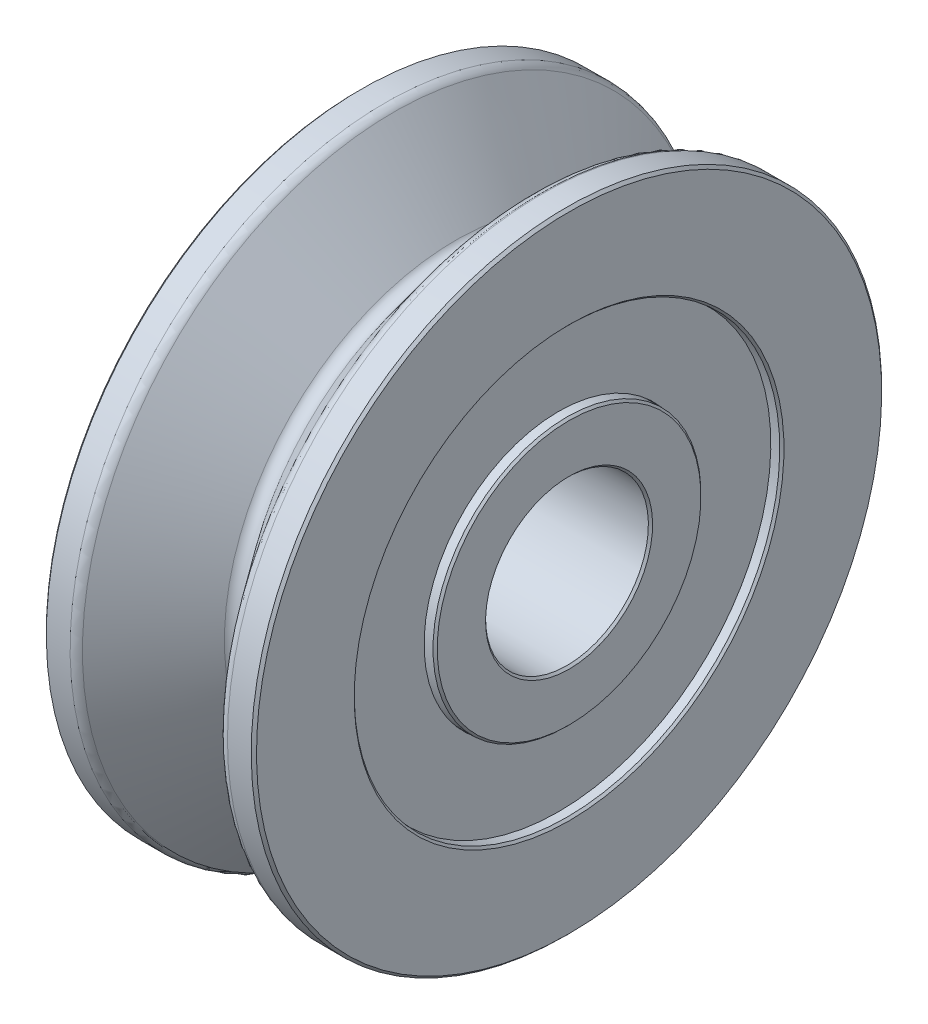
ISO-10303-21;
HEADER;
FILE_DESCRIPTION(('STEP AP214'),'2;1');
FILE_NAME('part.step','',(''),(''),'','','');
FILE_SCHEMA(('AUTOMOTIVE_DESIGN { 1 0 10303 214 1 1 1 1 }'));
ENDSEC;
DATA;
#1=APPLICATION_CONTEXT('core data for automotive mechanical design processes');
#2=APPLICATION_PROTOCOL_DEFINITION('international standard','automotive_design',2000,#1);
#3=PRODUCT_CONTEXT('',#1,'mechanical');
#4=PRODUCT('Part','Part','',(#3));
#5=PRODUCT_RELATED_PRODUCT_CATEGORY('part','',(#4));
#6=PRODUCT_DEFINITION_FORMATION('','',#4);
#7=PRODUCT_DEFINITION_CONTEXT('part definition',#1,'design');
#8=PRODUCT_DEFINITION('design','',#6,#7);
#9=PRODUCT_DEFINITION_SHAPE('','',#8);
#10=(LENGTH_UNIT() NAMED_UNIT(*) SI_UNIT(.MILLI.,.METRE.));
#11=(NAMED_UNIT(*) PLANE_ANGLE_UNIT() SI_UNIT($,.RADIAN.));
#12=(NAMED_UNIT(*) SI_UNIT($,.STERADIAN.) SOLID_ANGLE_UNIT());
#13=UNCERTAINTY_MEASURE_WITH_UNIT(LENGTH_MEASURE(1.E-05),#10,'distance_accuracy_value','');
#14=(GEOMETRIC_REPRESENTATION_CONTEXT(3) GLOBAL_UNCERTAINTY_ASSIGNED_CONTEXT((#13)) GLOBAL_UNIT_ASSIGNED_CONTEXT((#10,
#11,#12)) REPRESENTATION_CONTEXT('',''));
#15=CARTESIAN_POINT('',(0.,0.,0.));
#16=DIRECTION('',(0.,0.,1.));
#17=DIRECTION('',(1.,0.,0.));
#18=AXIS2_PLACEMENT_3D('',#15,#16,#17);
#19=CARTESIAN_POINT('',(1.8,0.,0.));
#20=DIRECTION('',(1.,0.,0.));
#21=DIRECTION('',(0.,1.,0.));
#22=AXIS2_PLACEMENT_3D('',#19,#20,#21);
#23=PLANE('',#22);
#24=CARTESIAN_POINT('',(1.8,0.,0.));
#25=DIRECTION('',(-1.,0.,0.));
#26=DIRECTION('',(0.,1.,0.));
#27=AXIS2_PLACEMENT_3D('',#24,#25,#26);
#28=CIRCLE('',#27,2.56);
#29=CARTESIAN_POINT('',(1.8,-2.56,0.));
#30=VERTEX_POINT('',#29);
#31=EDGE_CURVE('P0_E61',#30,#30,#28,.T.);
#32=ORIENTED_EDGE('',*,*,#31,.T.);
#33=EDGE_LOOP('',(#32));
#34=FACE_BOUND('',#33,.T.);
#35=CARTESIAN_POINT('',(1.8,0.,0.));
#36=DIRECTION('',(1.,0.,0.));
#37=DIRECTION('',(0.,1.,0.));
#38=AXIS2_PLACEMENT_3D('',#35,#36,#37);
#39=CIRCLE('',#38,4.04);
#40=CARTESIAN_POINT('',(1.8,-4.04,0.));
#41=VERTEX_POINT('',#40);
#42=EDGE_CURVE('P0_E28',#41,#41,#39,.T.);
#43=ORIENTED_EDGE('',*,*,#42,.T.);
#44=EDGE_LOOP('',(#43));
#45=FACE_BOUND('',#44,.T.);
#46=ADVANCED_FACE('P0_F17',(#34,#45),#23,.T.);
#47=CARTESIAN_POINT('',(0.,0.,0.));
#48=DIRECTION('',(1.,0.,0.));
#49=DIRECTION('',(0.,1.,0.));
#50=AXIS2_PLACEMENT_3D('',#47,#48,#49);
#51=CYLINDRICAL_SURFACE('',#50,4.04);
#52=ORIENTED_EDGE('',*,*,#42,.F.);
#53=DIRECTION('',(-1.,0.,0.));
#54=VECTOR('',#53,1.);
#55=CARTESIAN_POINT('',(0.,-4.04,0.));
#56=LINE('',#55,#54);
#57=CARTESIAN_POINT('',(-1.8,-4.04,0.));
#58=VERTEX_POINT('',#57);
#59=EDGE_CURVE('P0_E11',#41,#58,#56,.T.);
#60=ORIENTED_EDGE('',*,*,#59,.T.);
#61=CARTESIAN_POINT('',(-1.8,0.,0.));
#62=DIRECTION('',(-1.,0.,0.));
#63=DIRECTION('',(0.,1.,0.));
#64=AXIS2_PLACEMENT_3D('',#61,#62,#63);
#65=CIRCLE('',#64,4.04);
#66=EDGE_CURVE('P0_E51',#58,#58,#65,.T.);
#67=ORIENTED_EDGE('',*,*,#66,.F.);
#68=ORIENTED_EDGE('',*,*,#59,.F.);
#69=EDGE_LOOP('',(#52,#60,#67,#68));
#70=FACE_BOUND('',#69,.T.);
#71=ADVANCED_FACE('P0_F50',(#70),#51,.T.);
#72=CARTESIAN_POINT('',(0.,0.,0.));
#73=DIRECTION('',(1.,0.,0.));
#74=DIRECTION('',(0.,1.,0.));
#75=AXIS2_PLACEMENT_3D('',#72,#73,#74);
#76=CYLINDRICAL_SURFACE('',#75,2.56);
#77=ORIENTED_EDGE('',*,*,#31,.F.);
#78=DIRECTION('',(-1.,0.,0.));
#79=VECTOR('',#78,1.);
#80=CARTESIAN_POINT('',(0.,-2.56,0.));
#81=LINE('',#80,#79);
#82=CARTESIAN_POINT('',(-1.8,-2.56,0.));
#83=VERTEX_POINT('',#82);
#84=EDGE_CURVE('P0_E21',#30,#83,#81,.T.);
#85=ORIENTED_EDGE('',*,*,#84,.T.);
#86=CARTESIAN_POINT('',(-1.8,0.,0.));
#87=DIRECTION('',(1.,0.,0.));
#88=DIRECTION('',(0.,1.,0.));
#89=AXIS2_PLACEMENT_3D('',#86,#87,#88);
#90=CIRCLE('',#89,2.56);
#91=EDGE_CURVE('P0_E54',#83,#83,#90,.T.);
#92=ORIENTED_EDGE('',*,*,#91,.F.);
#93=ORIENTED_EDGE('',*,*,#84,.F.);
#94=EDGE_LOOP('',(#77,#85,#92,#93));
#95=FACE_BOUND('',#94,.T.);
#96=ADVANCED_FACE('P0_F79',(#95),#76,.F.);
#97=CARTESIAN_POINT('',(-1.8,0.,0.));
#98=DIRECTION('',(1.,0.,0.));
#99=DIRECTION('',(0.,1.,0.));
#100=AXIS2_PLACEMENT_3D('',#97,#98,#99);
#101=PLANE('',#100);
#102=ORIENTED_EDGE('',*,*,#91,.T.);
#103=EDGE_LOOP('',(#102));
#104=FACE_BOUND('',#103,.T.);
#105=ORIENTED_EDGE('',*,*,#66,.T.);
#106=EDGE_LOOP('',(#105));
#107=FACE_BOUND('',#106,.T.);
#108=ADVANCED_FACE('P0_F19',(#104,#107),#101,.F.);
#109=CLOSED_SHELL('',(#46,#71,#96,#108));
#110=MANIFOLD_SOLID_BREP('P0_B1',#109);
#111=CARTESIAN_POINT('',(-2.,0.,0.));
#112=DIRECTION('',(1.,0.,0.));
#113=DIRECTION('',(0.,1.,0.));
#114=AXIS2_PLACEMENT_3D('',#111,#112,#113);
#115=PLANE('',#114);
#116=CARTESIAN_POINT('',(-2.,0.,0.));
#117=DIRECTION('',(1.,0.,0.));
#118=DIRECTION('',(0.,1.,0.));
#119=AXIS2_PLACEMENT_3D('',#116,#117,#118);
#120=CIRCLE('',#119,1.55);
#121=CARTESIAN_POINT('',(-2.,-1.55,0.));
#122=VERTEX_POINT('',#121);
#123=EDGE_CURVE('P1_E64',#122,#122,#120,.T.);
#124=ORIENTED_EDGE('',*,*,#123,.T.);
#125=EDGE_LOOP('',(#124));
#126=FACE_BOUND('',#125,.T.);
#127=CARTESIAN_POINT('',(-2.,0.,0.));
#128=DIRECTION('',(-1.,0.,0.));
#129=DIRECTION('',(0.,1.,0.));
#130=AXIS2_PLACEMENT_3D('',#127,#128,#129);
#131=CIRCLE('',#130,2.55);
#132=CARTESIAN_POINT('',(-2.,-2.55,0.));
#133=VERTEX_POINT('',#132);
#134=EDGE_CURVE('P1_E11',#133,#133,#131,.T.);
#135=ORIENTED_EDGE('',*,*,#134,.T.);
#136=EDGE_LOOP('',(#135));
#137=FACE_BOUND('',#136,.T.);
#138=ADVANCED_FACE('P1_F17',(#126,#137),#115,.F.);
#139=CARTESIAN_POINT('',(0.,0.,0.));
#140=DIRECTION('',(1.,0.,0.));
#141=DIRECTION('',(0.,1.,0.));
#142=AXIS2_PLACEMENT_3D('',#139,#140,#141);
#143=CYLINDRICAL_SURFACE('',#142,2.55);
#144=CARTESIAN_POINT('',(1.96,0.,0.));
#145=DIRECTION('',(1.,0.,0.));
#146=DIRECTION('',(0.,1.,0.));
#147=AXIS2_PLACEMENT_3D('',#144,#145,#146);
#148=CIRCLE('',#147,2.55);
#149=CARTESIAN_POINT('',(1.96,-2.55,0.));
#150=VERTEX_POINT('',#149);
#151=EDGE_CURVE('P1_E21',#150,#150,#148,.T.);
#152=ORIENTED_EDGE('',*,*,#151,.F.);
#153=DIRECTION('',(-1.,0.,0.));
#154=VECTOR('',#153,1.);
#155=CARTESIAN_POINT('',(0.,-2.55,0.));
#156=LINE('',#155,#154);
#157=EDGE_CURVE('P1_E28',#150,#133,#156,.T.);
#158=ORIENTED_EDGE('',*,*,#157,.T.);
#159=ORIENTED_EDGE('',*,*,#134,.F.);
#160=ORIENTED_EDGE('',*,*,#157,.F.);
#161=EDGE_LOOP('',(#152,#158,#159,#160));
#162=FACE_BOUND('',#161,.T.);
#163=ADVANCED_FACE('P1_F107',(#162),#143,.T.);
#164=CARTESIAN_POINT('',(1.98,0.,0.));
#165=DIRECTION('',(-1.,0.,0.));
#166=DIRECTION('',(0.,1.,0.));
#167=AXIS2_PLACEMENT_3D('',#164,#165,#166);
#168=CONICAL_SURFACE('',#167,2.53,0.785398163397448);
#169=CARTESIAN_POINT('',(2.,0.,0.));
#170=DIRECTION('',(-1.,0.,0.));
#171=DIRECTION('',(0.,1.,0.));
#172=AXIS2_PLACEMENT_3D('',#169,#170,#171);
#173=CIRCLE('',#172,2.51);
#174=CARTESIAN_POINT('',(2.,-2.51,0.));
#175=VERTEX_POINT('',#174);
#176=EDGE_CURVE('P1_E66',#175,#175,#173,.T.);
#177=ORIENTED_EDGE('',*,*,#176,.T.);
#178=DIRECTION('',(-0.707106781186548,-0.707106781186548,0.));
#179=VECTOR('',#178,1.);
#180=CARTESIAN_POINT('',(1.98,-2.53,0.));
#181=LINE('',#180,#179);
#182=EDGE_CURVE('P1_E84',#175,#150,#181,.T.);
#183=ORIENTED_EDGE('',*,*,#182,.T.);
#184=ORIENTED_EDGE('',*,*,#151,.T.);
#185=ORIENTED_EDGE('',*,*,#182,.F.);
#186=EDGE_LOOP('',(#177,#183,#184,#185));
#187=FACE_BOUND('',#186,.T.);
#188=ADVANCED_FACE('P1_F109',(#187),#168,.T.);
#189=CARTESIAN_POINT('',(0.,0.,0.));
#190=DIRECTION('',(1.,0.,0.));
#191=DIRECTION('',(0.,1.,0.));
#192=AXIS2_PLACEMENT_3D('',#189,#190,#191);
#193=CYLINDRICAL_SURFACE('',#192,1.55);
#194=CARTESIAN_POINT('',(1.96,0.,0.));
#195=DIRECTION('',(-1.,0.,0.));
#196=DIRECTION('',(0.,1.,0.));
#197=AXIS2_PLACEMENT_3D('',#194,#195,#196);
#198=CIRCLE('',#197,1.55);
#199=CARTESIAN_POINT('',(1.96,-1.55,0.));
#200=VERTEX_POINT('',#199);
#201=EDGE_CURVE('P1_E62',#200,#200,#198,.T.);
#202=ORIENTED_EDGE('',*,*,#201,.F.);
#203=DIRECTION('',(-1.,0.,0.));
#204=VECTOR('',#203,1.);
#205=CARTESIAN_POINT('',(0.,-1.55,0.));
#206=LINE('',#205,#204);
#207=EDGE_CURVE('P1_E59',#200,#122,#206,.T.);
#208=ORIENTED_EDGE('',*,*,#207,.T.);
#209=ORIENTED_EDGE('',*,*,#123,.F.);
#210=ORIENTED_EDGE('',*,*,#207,.F.);
#211=EDGE_LOOP('',(#202,#208,#209,#210));
#212=FACE_BOUND('',#211,.T.);
#213=ADVANCED_FACE('P1_F61',(#212),#193,.F.);
#214=CARTESIAN_POINT('',(2.,0.,0.));
#215=DIRECTION('',(1.,0.,0.));
#216=DIRECTION('',(0.,1.,0.));
#217=AXIS2_PLACEMENT_3D('',#214,#215,#216);
#218=PLANE('',#217);
#219=CARTESIAN_POINT('',(2.,0.,0.));
#220=DIRECTION('',(1.,0.,0.));
#221=DIRECTION('',(0.,1.,0.));
#222=AXIS2_PLACEMENT_3D('',#219,#220,#221);
#223=CIRCLE('',#222,1.59);
#224=CARTESIAN_POINT('',(2.,-1.59,0.));
#225=VERTEX_POINT('',#224);
#226=EDGE_CURVE('P1_E81',#225,#225,#223,.T.);
#227=ORIENTED_EDGE('',*,*,#226,.F.);
#228=EDGE_LOOP('',(#227));
#229=FACE_BOUND('',#228,.T.);
#230=ORIENTED_EDGE('',*,*,#176,.F.);
#231=EDGE_LOOP('',(#230));
#232=FACE_BOUND('',#231,.T.);
#233=ADVANCED_FACE('P1_F19',(#229,#232),#218,.T.);
#234=CARTESIAN_POINT('',(1.98,0.,0.));
#235=DIRECTION('',(1.,0.,0.));
#236=DIRECTION('',(0.,1.,0.));
#237=AXIS2_PLACEMENT_3D('',#234,#235,#236);
#238=CONICAL_SURFACE('',#237,1.57,0.785398163397448);
#239=ORIENTED_EDGE('',*,*,#226,.T.);
#240=DIRECTION('',(-0.707106781186548,0.707106781186548,0.));
#241=VECTOR('',#240,1.);
#242=CARTESIAN_POINT('',(1.98,-1.57,0.));
#243=LINE('',#242,#241);
#244=EDGE_CURVE('P1_E71',#225,#200,#243,.T.);
#245=ORIENTED_EDGE('',*,*,#244,.T.);
#246=ORIENTED_EDGE('',*,*,#201,.T.);
#247=ORIENTED_EDGE('',*,*,#244,.F.);
#248=EDGE_LOOP('',(#239,#245,#246,#247));
#249=FACE_BOUND('',#248,.T.);
#250=ADVANCED_FACE('P1_F70',(#249),#238,.F.);
#251=CLOSED_SHELL('',(#138,#163,#188,#213,#233,#250));
#252=MANIFOLD_SOLID_BREP('P1_B1',#251);
#253=CARTESIAN_POINT('',(0.,0.,0.));
#254=DIRECTION('',(-1.,0.,0.));
#255=DIRECTION('',(0.,0.,1.));
#256=AXIS2_PLACEMENT_3D('',#253,#254,#255);
#257=TOROIDAL_SURFACE('',#256,4.52576440717118,0.2);
#258=CARTESIAN_POINT('',(0.157870443475266,0.,0.));
#259=DIRECTION('',(-1.,0.,0.));
#260=DIRECTION('',(0.,0.,-1.));
#261=AXIS2_PLACEMENT_3D('',#258,#259,#260);
#262=CIRCLE('',#261,4.4029762844682);
#263=CARTESIAN_POINT('',(0.157870443475265,0.,-4.4029762844682));
#264=VERTEX_POINT('',#263);
#265=EDGE_CURVE('P2_E140',#264,#264,#262,.T.);
#266=ORIENTED_EDGE('',*,*,#265,.T.);
#267=CARTESIAN_POINT('',(0.,0.,-4.52576440717118));
#268=DIRECTION('',(0.,-1.,0.));
#269=DIRECTION('',(0.,0.,-1.));
#270=AXIS2_PLACEMENT_3D('',#267,#268,#269);
#271=CIRCLE('',#270,0.2);
#272=CARTESIAN_POINT('',(-0.157870443475265,0.,-4.4029762844682));
#273=VERTEX_POINT('',#272);
#274=EDGE_CURVE('P2_E11',#264,#273,#271,.T.);
#275=ORIENTED_EDGE('',*,*,#274,.T.);
#276=CARTESIAN_POINT('',(-0.157870443475266,0.,0.));
#277=DIRECTION('',(1.,0.,0.));
#278=DIRECTION('',(0.,0.,-1.));
#279=AXIS2_PLACEMENT_3D('',#276,#277,#278);
#280=CIRCLE('',#279,4.4029762844682);
#281=EDGE_CURVE('P2_E260',#273,#273,#280,.T.);
#282=ORIENTED_EDGE('',*,*,#281,.T.);
#283=ORIENTED_EDGE('',*,*,#274,.F.);
#284=EDGE_LOOP('',(#266,#275,#282,#283));
#285=FACE_BOUND('',#284,.T.);
#286=ADVANCED_FACE('P2_F17',(#285),#257,.F.);
#287=CARTESIAN_POINT('',(-0.7,0.,0.));
#288=DIRECTION('',(-1.,0.,0.));
#289=DIRECTION('',(0.,0.,1.));
#290=AXIS2_PLACEMENT_3D('',#287,#288,#289);
#291=CONICAL_SURFACE('',#290,5.1,0.90975315794421);
#292=ORIENTED_EDGE('',*,*,#281,.F.);
#293=DIRECTION('',(-0.61394061351492,0.,-0.789352217376327));
#294=VECTOR('',#293,1.);
#295=CARTESIAN_POINT('',(-0.7,0.,-5.1));
#296=LINE('',#295,#294);
#297=CARTESIAN_POINT('',(-1.33994631765788,0.,-5.92278812270298));
#298=VERTEX_POINT('',#297);
#299=EDGE_CURVE('P2_E21',#273,#298,#296,.T.);
#300=ORIENTED_EDGE('',*,*,#299,.T.);
#301=CARTESIAN_POINT('',(-1.33994631765788,0.,0.));
#302=DIRECTION('',(-1.,0.,0.));
#303=DIRECTION('',(0.,0.,-1.));
#304=AXIS2_PLACEMENT_3D('',#301,#302,#303);
#305=CIRCLE('',#304,5.92278812270298);
#306=EDGE_CURVE('P2_E137',#298,#298,#305,.T.);
#307=ORIENTED_EDGE('',*,*,#306,.F.);
#308=ORIENTED_EDGE('',*,*,#299,.F.);
#309=EDGE_LOOP('',(#292,#300,#307,#308));
#310=FACE_BOUND('',#309,.T.);
#311=ADVANCED_FACE('P2_F234',(#310),#291,.T.);
#312=CARTESIAN_POINT('',(-1.49781676113314,0.,0.));
#313=DIRECTION('',(-1.,0.,0.));
#314=DIRECTION('',(0.,0.,1.));
#315=AXIS2_PLACEMENT_3D('',#312,#313,#314);
#316=TOROIDAL_SURFACE('',#315,5.8,0.2);
#317=CARTESIAN_POINT('',(-1.49781676113314,0.,0.));
#318=DIRECTION('',(1.,0.,0.));
#319=DIRECTION('',(0.,0.,-1.));
#320=AXIS2_PLACEMENT_3D('',#317,#318,#319);
#321=CIRCLE('',#320,6.);
#322=CARTESIAN_POINT('',(-1.49781676113314,0.,-6.));
#323=VERTEX_POINT('',#322);
#324=CARTESIAN_POINT('',(-1.49781676113314,-6.,0.));
#325=VERTEX_POINT('',#324);
#326=EDGE_CURVE('P2_E112',#323,#325,#321,.T.);
#327=ORIENTED_EDGE('',*,*,#326,.T.);
#328=CARTESIAN_POINT('',(-1.49781676113314,0.,0.));
#329=DIRECTION('',(1.,0.,0.));
#330=DIRECTION('',(0.,0.,-1.));
#331=AXIS2_PLACEMENT_3D('',#328,#329,#330);
#332=CIRCLE('',#331,6.);
#333=EDGE_CURVE('P2_E118',#325,#323,#332,.T.);
#334=ORIENTED_EDGE('',*,*,#333,.T.);
#335=CARTESIAN_POINT('',(-1.49781676113314,0.,-5.8));
#336=DIRECTION('',(0.,-1.,0.));
#337=DIRECTION('',(0.,0.,-1.));
#338=AXIS2_PLACEMENT_3D('',#335,#336,#337);
#339=CIRCLE('',#338,0.2);
#340=EDGE_CURVE('P2_E126',#323,#298,#339,.T.);
#341=ORIENTED_EDGE('',*,*,#340,.T.);
#342=ORIENTED_EDGE('',*,*,#306,.T.);
#343=ORIENTED_EDGE('',*,*,#340,.F.);
#344=EDGE_LOOP('',(#327,#334,#341,#342,#343));
#345=FACE_BOUND('',#344,.T.);
#346=ADVANCED_FACE('P2_F19',(#345),#316,.T.);
#347=CARTESIAN_POINT('',(0.7,0.,0.));
#348=DIRECTION('',(1.,0.,0.));
#349=DIRECTION('',(0.,0.,1.));
#350=AXIS2_PLACEMENT_3D('',#347,#348,#349);
#351=CONICAL_SURFACE('',#350,5.1,0.90975315794421);
#352=CARTESIAN_POINT('',(1.33994631765788,0.,0.));
#353=DIRECTION('',(1.,0.,0.));
#354=DIRECTION('',(0.,0.,-1.));
#355=AXIS2_PLACEMENT_3D('',#352,#353,#354);
#356=CIRCLE('',#355,5.92278812270298);
#357=CARTESIAN_POINT('',(1.33994631765788,0.,5.92278812270298));
#358=VERTEX_POINT('',#357);
#359=CARTESIAN_POINT('',(1.33994631765788,0.,-5.92278812270299));
#360=VERTEX_POINT('',#359);
#361=EDGE_CURVE('P2_E141',#358,#360,#356,.T.);
#362=ORIENTED_EDGE('',*,*,#361,.F.);
#363=CARTESIAN_POINT('',(1.33994631765788,0.,0.));
#364=DIRECTION('',(1.,0.,0.));
#365=DIRECTION('',(0.,0.,-1.));
#366=AXIS2_PLACEMENT_3D('',#363,#364,#365);
#367=CIRCLE('',#366,5.92278812270298);
#368=EDGE_CURVE('P2_E144',#360,#358,#367,.T.);
#369=ORIENTED_EDGE('',*,*,#368,.F.);
#370=DIRECTION('',(-0.61394061351492,0.,0.789352217376327));
#371=VECTOR('',#370,1.);
#372=CARTESIAN_POINT('',(0.7,0.,-5.1));
#373=LINE('',#372,#371);
#374=EDGE_CURVE('P2_E152',#360,#264,#373,.T.);
#375=ORIENTED_EDGE('',*,*,#374,.T.);
#376=ORIENTED_EDGE('',*,*,#265,.F.);
#377=ORIENTED_EDGE('',*,*,#374,.F.);
#378=EDGE_LOOP('',(#362,#369,#375,#376,#377));
#379=FACE_BOUND('',#378,.T.);
#380=ADVANCED_FACE('P2_F249',(#379),#351,.T.);
#381=CARTESIAN_POINT('',(1.49781676113314,0.,0.));
#382=DIRECTION('',(1.,0.,0.));
#383=DIRECTION('',(0.,0.,-1.));
#384=AXIS2_PLACEMENT_3D('',#381,#382,#383);
#385=TOROIDAL_SURFACE('',#384,5.8,0.2);
#386=CARTESIAN_POINT('',(1.49781676113314,0.,0.));
#387=DIRECTION('',(-1.,0.,0.));
#388=DIRECTION('',(0.,0.,-1.));
#389=AXIS2_PLACEMENT_3D('',#386,#387,#388);
#390=CIRCLE('',#389,6.);
#391=CARTESIAN_POINT('',(1.49781676113314,0.,6.));
#392=VERTEX_POINT('',#391);
#393=CARTESIAN_POINT('',(1.49781676113314,-6.,0.));
#394=VERTEX_POINT('',#393);
#395=EDGE_CURVE('P2_E176',#392,#394,#390,.T.);
#396=ORIENTED_EDGE('',*,*,#395,.T.);
#397=CARTESIAN_POINT('',(1.49781676113314,0.,0.));
#398=DIRECTION('',(-1.,0.,0.));
#399=DIRECTION('',(0.,0.,-1.));
#400=AXIS2_PLACEMENT_3D('',#397,#398,#399);
#401=CIRCLE('',#400,6.);
#402=EDGE_CURVE('P2_E170',#394,#392,#401,.T.);
#403=ORIENTED_EDGE('',*,*,#402,.T.);
#404=CARTESIAN_POINT('',(1.49781676113314,0.,5.8));
#405=DIRECTION('',(0.,-1.,0.));
#406=DIRECTION('',(0.,0.,1.));
#407=AXIS2_PLACEMENT_3D('',#404,#405,#406);
#408=CIRCLE('',#407,0.2);
#409=EDGE_CURVE('P2_E117',#392,#358,#408,.T.);
#410=ORIENTED_EDGE('',*,*,#409,.T.);
#411=ORIENTED_EDGE('',*,*,#361,.T.);
#412=ORIENTED_EDGE('',*,*,#368,.T.);
#413=ORIENTED_EDGE('',*,*,#409,.F.);
#414=EDGE_LOOP('',(#396,#403,#410,#411,#412,#413));
#415=FACE_BOUND('',#414,.T.);
#416=ADVANCED_FACE('P2_F246',(#415),#385,.T.);
#417=CARTESIAN_POINT('',(-2.,0.,0.));
#418=DIRECTION('',(1.,0.,0.));
#419=DIRECTION('',(0.,1.,0.));
#420=AXIS2_PLACEMENT_3D('',#417,#418,#419);
#421=PLANE('',#420);
#422=CARTESIAN_POINT('',(-2.,0.,0.));
#423=DIRECTION('',(1.,0.,0.));
#424=DIRECTION('',(0.,1.,0.));
#425=AXIS2_PLACEMENT_3D('',#422,#423,#424);
#426=CIRCLE('',#425,4.05);
#427=CARTESIAN_POINT('',(-2.,-4.05,0.));
#428=VERTEX_POINT('',#427);
#429=EDGE_CURVE('P2_E73',#428,#428,#426,.T.);
#430=ORIENTED_EDGE('',*,*,#429,.T.);
#431=EDGE_LOOP('',(#430));
#432=FACE_BOUND('',#431,.T.);
#433=CARTESIAN_POINT('',(-2.,0.,0.));
#434=DIRECTION('',(1.,0.,0.));
#435=DIRECTION('',(0.,1.,0.));
#436=AXIS2_PLACEMENT_3D('',#433,#434,#435);
#437=CIRCLE('',#436,5.95);
#438=CARTESIAN_POINT('',(-2.,-5.95,0.));
#439=VERTEX_POINT('',#438);
#440=EDGE_CURVE('P2_E167',#439,#439,#437,.T.);
#441=ORIENTED_EDGE('',*,*,#440,.F.);
#442=EDGE_LOOP('',(#441));
#443=FACE_BOUND('',#442,.T.);
#444=ADVANCED_FACE('P2_F248',(#432,#443),#421,.F.);
#445=CARTESIAN_POINT('',(0.,0.,0.));
#446=DIRECTION('',(1.,0.,0.));
#447=DIRECTION('',(0.,1.,0.));
#448=AXIS2_PLACEMENT_3D('',#445,#446,#447);
#449=CYLINDRICAL_SURFACE('',#448,6.);
#450=ORIENTED_EDGE('',*,*,#326,.F.);
#451=ORIENTED_EDGE('',*,*,#333,.F.);
#452=DIRECTION('',(-1.,0.,0.));
#453=VECTOR('',#452,1.);
#454=CARTESIAN_POINT('',(0.,-6.,0.));
#455=LINE('',#454,#453);
#456=CARTESIAN_POINT('',(-1.95,-6.,0.));
#457=VERTEX_POINT('',#456);
#458=EDGE_CURVE('P2_E108',#325,#457,#455,.T.);
#459=ORIENTED_EDGE('',*,*,#458,.T.);
#460=CARTESIAN_POINT('',(-1.95,0.,0.));
#461=DIRECTION('',(-1.,0.,0.));
#462=DIRECTION('',(0.,1.,0.));
#463=AXIS2_PLACEMENT_3D('',#460,#461,#462);
#464=CIRCLE('',#463,6.);
#465=EDGE_CURVE('P2_E114',#457,#457,#464,.T.);
#466=ORIENTED_EDGE('',*,*,#465,.F.);
#467=ORIENTED_EDGE('',*,*,#458,.F.);
#468=EDGE_LOOP('',(#450,#451,#459,#466,#467));
#469=FACE_BOUND('',#468,.T.);
#470=ADVANCED_FACE('P2_F110',(#469),#449,.T.);
#471=CARTESIAN_POINT('',(-1.975,0.,0.));
#472=DIRECTION('',(1.,0.,0.));
#473=DIRECTION('',(0.,1.,0.));
#474=AXIS2_PLACEMENT_3D('',#471,#472,#473);
#475=CONICAL_SURFACE('',#474,5.975,0.785398163397448);
#476=ORIENTED_EDGE('',*,*,#440,.T.);
#477=DIRECTION('',(0.707106781186548,-0.707106781186548,0.));
#478=VECTOR('',#477,1.);
#479=CARTESIAN_POINT('',(-1.975,-5.975,0.));
#480=LINE('',#479,#478);
#481=EDGE_CURVE('P2_E133',#439,#457,#480,.T.);
#482=ORIENTED_EDGE('',*,*,#481,.T.);
#483=ORIENTED_EDGE('',*,*,#465,.T.);
#484=ORIENTED_EDGE('',*,*,#481,.F.);
#485=EDGE_LOOP('',(#476,#482,#483,#484));
#486=FACE_BOUND('',#485,.T.);
#487=ADVANCED_FACE('P2_F245',(#486),#475,.T.);
#488=CARTESIAN_POINT('',(0.,0.,0.));
#489=DIRECTION('',(1.,0.,0.));
#490=DIRECTION('',(0.,1.,0.));
#491=AXIS2_PLACEMENT_3D('',#488,#489,#490);
#492=CYLINDRICAL_SURFACE('',#491,6.);
#493=CARTESIAN_POINT('',(1.95,0.,0.));
#494=DIRECTION('',(1.,0.,0.));
#495=DIRECTION('',(0.,1.,0.));
#496=AXIS2_PLACEMENT_3D('',#493,#494,#495);
#497=CIRCLE('',#496,6.);
#498=CARTESIAN_POINT('',(1.95,-6.,0.));
#499=VERTEX_POINT('',#498);
#500=EDGE_CURVE('P2_E166',#499,#499,#497,.T.);
#501=ORIENTED_EDGE('',*,*,#500,.F.);
#502=DIRECTION('',(-1.,0.,0.));
#503=VECTOR('',#502,1.);
#504=CARTESIAN_POINT('',(0.,-6.,0.));
#505=LINE('',#504,#503);
#506=EDGE_CURVE('P2_E62',#499,#394,#505,.T.);
#507=ORIENTED_EDGE('',*,*,#506,.T.);
#508=ORIENTED_EDGE('',*,*,#395,.F.);
#509=ORIENTED_EDGE('',*,*,#402,.F.);
#510=ORIENTED_EDGE('',*,*,#506,.F.);
#511=EDGE_LOOP('',(#501,#507,#508,#509,#510));
#512=FACE_BOUND('',#511,.T.);
#513=ADVANCED_FACE('P2_F243',(#512),#492,.T.);
#514=CARTESIAN_POINT('',(1.975,0.,0.));
#515=DIRECTION('',(-1.,0.,0.));
#516=DIRECTION('',(0.,1.,0.));
#517=AXIS2_PLACEMENT_3D('',#514,#515,#516);
#518=CONICAL_SURFACE('',#517,5.975,0.785398163397448);
#519=CARTESIAN_POINT('',(2.,0.,0.));
#520=DIRECTION('',(-1.,0.,0.));
#521=DIRECTION('',(0.,1.,0.));
#522=AXIS2_PLACEMENT_3D('',#519,#520,#521);
#523=CIRCLE('',#522,5.95);
#524=CARTESIAN_POINT('',(2.,-5.95,0.));
#525=VERTEX_POINT('',#524);
#526=EDGE_CURVE('P2_E197',#525,#525,#523,.T.);
#527=ORIENTED_EDGE('',*,*,#526,.T.);
#528=DIRECTION('',(-0.707106781186548,-0.707106781186548,0.));
#529=VECTOR('',#528,1.);
#530=CARTESIAN_POINT('',(1.975,-5.975,0.));
#531=LINE('',#530,#529);
#532=EDGE_CURVE('P2_E162',#525,#499,#531,.T.);
#533=ORIENTED_EDGE('',*,*,#532,.T.);
#534=ORIENTED_EDGE('',*,*,#500,.T.);
#535=ORIENTED_EDGE('',*,*,#532,.F.);
#536=EDGE_LOOP('',(#527,#533,#534,#535));
#537=FACE_BOUND('',#536,.T.);
#538=ADVANCED_FACE('P2_F213',(#537),#518,.T.);
#539=CARTESIAN_POINT('',(0.,0.,0.));
#540=DIRECTION('',(1.,0.,0.));
#541=DIRECTION('',(0.,1.,0.));
#542=AXIS2_PLACEMENT_3D('',#539,#540,#541);
#543=CYLINDRICAL_SURFACE('',#542,4.05);
#544=CARTESIAN_POINT('',(1.96,0.,0.));
#545=DIRECTION('',(-1.,0.,0.));
#546=DIRECTION('',(0.,1.,0.));
#547=AXIS2_PLACEMENT_3D('',#544,#545,#546);
#548=CIRCLE('',#547,4.05);
#549=CARTESIAN_POINT('',(1.96,-4.05,0.));
#550=VERTEX_POINT('',#549);
#551=EDGE_CURVE('P2_E205',#550,#550,#548,.T.);
#552=ORIENTED_EDGE('',*,*,#551,.F.);
#553=DIRECTION('',(-1.,0.,0.));
#554=VECTOR('',#553,1.);
#555=CARTESIAN_POINT('',(0.,-4.05,0.));
#556=LINE('',#555,#554);
#557=EDGE_CURVE('P2_E192',#550,#428,#556,.T.);
#558=ORIENTED_EDGE('',*,*,#557,.T.);
#559=ORIENTED_EDGE('',*,*,#429,.F.);
#560=ORIENTED_EDGE('',*,*,#557,.F.);
#561=EDGE_LOOP('',(#552,#558,#559,#560));
#562=FACE_BOUND('',#561,.T.);
#563=ADVANCED_FACE('P2_F218',(#562),#543,.F.);
#564=CARTESIAN_POINT('',(2.,0.,0.));
#565=DIRECTION('',(1.,0.,0.));
#566=DIRECTION('',(0.,1.,0.));
#567=AXIS2_PLACEMENT_3D('',#564,#565,#566);
#568=PLANE('',#567);
#569=CARTESIAN_POINT('',(2.,0.,0.));
#570=DIRECTION('',(1.,0.,0.));
#571=DIRECTION('',(0.,1.,0.));
#572=AXIS2_PLACEMENT_3D('',#569,#570,#571);
#573=CIRCLE('',#572,4.09);
#574=CARTESIAN_POINT('',(2.,-4.09,0.));
#575=VERTEX_POINT('',#574);
#576=EDGE_CURVE('P2_E201',#575,#575,#573,.T.);
#577=ORIENTED_EDGE('',*,*,#576,.F.);
#578=EDGE_LOOP('',(#577));
#579=FACE_BOUND('',#578,.T.);
#580=ORIENTED_EDGE('',*,*,#526,.F.);
#581=EDGE_LOOP('',(#580));
#582=FACE_BOUND('',#581,.T.);
#583=ADVANCED_FACE('P2_F215',(#579,#582),#568,.T.);
#584=CARTESIAN_POINT('',(1.98,0.,0.));
#585=DIRECTION('',(1.,0.,0.));
#586=DIRECTION('',(0.,1.,0.));
#587=AXIS2_PLACEMENT_3D('',#584,#585,#586);
#588=CONICAL_SURFACE('',#587,4.07,0.785398163397448);
#589=ORIENTED_EDGE('',*,*,#576,.T.);
#590=DIRECTION('',(-0.707106781186548,0.707106781186548,0.));
#591=VECTOR('',#590,1.);
#592=CARTESIAN_POINT('',(1.98,-4.07,0.));
#593=LINE('',#592,#591);
#594=EDGE_CURVE('P2_E160',#575,#550,#593,.T.);
#595=ORIENTED_EDGE('',*,*,#594,.T.);
#596=ORIENTED_EDGE('',*,*,#551,.T.);
#597=ORIENTED_EDGE('',*,*,#594,.F.);
#598=EDGE_LOOP('',(#589,#595,#596,#597));
#599=FACE_BOUND('',#598,.T.);
#600=ADVANCED_FACE('P2_F217',(#599),#588,.F.);
#601=CLOSED_SHELL('',(#286,#311,#346,#380,#416,#444,#470,#487,#513,#538,#563,#583,#600));
#602=MANIFOLD_SOLID_BREP('P2_B1',#601);
#603=ADVANCED_BREP_SHAPE_REPRESENTATION('',(#18,#110,#252,#602),#14);
#604=SHAPE_DEFINITION_REPRESENTATION(#9,#603);
ENDSEC;
END-ISO-10303-21;
